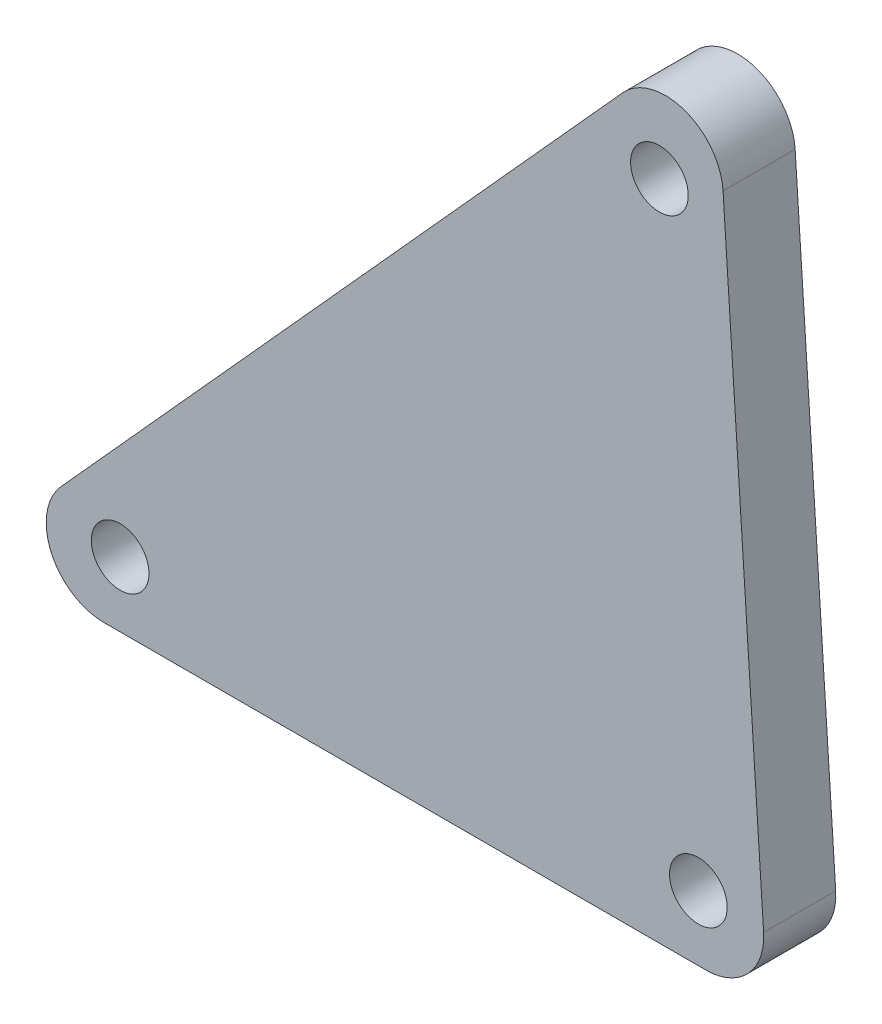
ISO-10303-21;
HEADER;
FILE_DESCRIPTION(('STEP AP214'),'2;1');
FILE_NAME('part.step','',(''),(''),'','','');
FILE_SCHEMA(('AUTOMOTIVE_DESIGN { 1 0 10303 214 1 1 1 1 }'));
ENDSEC;
DATA;
#1=APPLICATION_CONTEXT('core data for automotive mechanical design processes');
#2=APPLICATION_PROTOCOL_DEFINITION('international standard','automotive_design',2000,#1);
#3=PRODUCT_CONTEXT('',#1,'mechanical');
#4=PRODUCT('Part','Part','',(#3));
#5=PRODUCT_RELATED_PRODUCT_CATEGORY('part','',(#4));
#6=PRODUCT_DEFINITION_FORMATION('','',#4);
#7=PRODUCT_DEFINITION_CONTEXT('part definition',#1,'design');
#8=PRODUCT_DEFINITION('design','',#6,#7);
#9=PRODUCT_DEFINITION_SHAPE('','',#8);
#10=(LENGTH_UNIT() NAMED_UNIT(*) SI_UNIT(.MILLI.,.METRE.));
#11=(NAMED_UNIT(*) PLANE_ANGLE_UNIT() SI_UNIT($,.RADIAN.));
#12=(NAMED_UNIT(*) SI_UNIT($,.STERADIAN.) SOLID_ANGLE_UNIT());
#13=UNCERTAINTY_MEASURE_WITH_UNIT(LENGTH_MEASURE(1.E-05),#10,'distance_accuracy_value','');
#14=(GEOMETRIC_REPRESENTATION_CONTEXT(3) GLOBAL_UNCERTAINTY_ASSIGNED_CONTEXT((#13)) GLOBAL_UNIT_ASSIGNED_CONTEXT((#10,
#11,#12)) REPRESENTATION_CONTEXT('',''));
#15=CARTESIAN_POINT('',(0.,0.,0.));
#16=DIRECTION('',(0.,0.,1.));
#17=DIRECTION('',(1.,0.,0.));
#18=AXIS2_PLACEMENT_3D('',#15,#16,#17);
#19=CARTESIAN_POINT('',(3.23467115534947,-41.9120104857433,2.5));
#20=DIRECTION('',(0.,0.,1.));
#21=DIRECTION('',(1.,0.,0.));
#22=AXIS2_PLACEMENT_3D('',#19,#20,#21);
#23=PLANE('',#22);
#24=CARTESIAN_POINT('',(2.70099750623443,-41.4120104857433,2.5));
#25=DIRECTION('',(0.,0.,1.));
#26=DIRECTION('',(1.,0.,0.));
#27=AXIS2_PLACEMENT_3D('',#24,#25,#26);
#28=CIRCLE('',#27,2.);
#29=CARTESIAN_POINT('',(4.70099750623443,-41.4120104857433,2.5));
#30=VERTEX_POINT('',#29);
#31=EDGE_CURVE('E184',#30,#30,#28,.T.);
#32=ORIENTED_EDGE('',*,*,#31,.F.);
#33=EDGE_LOOP('',(#32));
#34=FACE_BOUND('',#33,.T.);
#35=CARTESIAN_POINT('',(3.23467115534947,-41.9120104857433,2.5));
#36=DIRECTION('',(0.,0.,1.));
#37=DIRECTION('',(1.,0.,0.));
#38=AXIS2_PLACEMENT_3D('',#35,#36,#37);
#39=CIRCLE('',#38,4.);
#40=CARTESIAN_POINT('',(3.23467115534944,-45.9120104857433,2.5));
#41=VERTEX_POINT('',#40);
#42=CARTESIAN_POINT('',(7.22619023831268,-41.6516733767087,2.5));
#43=VERTEX_POINT('',#42);
#44=EDGE_CURVE('E129',#41,#43,#39,.T.);
#45=ORIENTED_EDGE('',*,*,#44,.T.);
#46=DIRECTION('',(-0.0650842772586609,0.997879770740803,0.));
#47=VECTOR('',#46,1.);
#48=CARTESIAN_POINT('',(7.22619023831268,-41.6516733767087,2.5));
#49=LINE('',#48,#47);
#50=CARTESIAN_POINT('',(4.41345232933386,1.47355406664054,2.5));
#51=VERTEX_POINT('',#50);
#52=EDGE_CURVE('E87',#43,#51,#49,.T.);
#53=ORIENTED_EDGE('',*,*,#52,.T.);
#54=CARTESIAN_POINT('',(0.421933246370646,1.21321695760599,2.5));
#55=DIRECTION('',(0.,0.,1.));
#56=DIRECTION('',(1.,0.,0.));
#57=AXIS2_PLACEMENT_3D('',#54,#55,#56);
#58=CIRCLE('',#57,4.);
#59=CARTESIAN_POINT('',(-2.54666965583324,3.89414903601205,2.5));
#60=VERTEX_POINT('',#59);
#61=EDGE_CURVE('E100',#51,#60,#58,.T.);
#62=ORIENTED_EDGE('',*,*,#61,.T.);
#63=DIRECTION('',(-0.670233019601534,-0.742150725550956,0.));
#64=VECTOR('',#63,1.);
#65=CARTESIAN_POINT('',(-2.54666965583324,3.89414903601205,2.5));
#66=LINE('',#65,#64);
#67=CARTESIAN_POINT('',(-41.492870764646,-39.2310784073371,2.5));
#68=VERTEX_POINT('',#67);
#69=EDGE_CURVE('E94',#60,#68,#66,.T.);
#70=ORIENTED_EDGE('',*,*,#69,.T.);
#71=CARTESIAN_POINT('',(-38.5242678624422,-41.9120104857433,2.5));
#72=DIRECTION('',(0.,0.,1.));
#73=DIRECTION('',(-1.,0.,0.));
#74=AXIS2_PLACEMENT_3D('',#71,#72,#73);
#75=CIRCLE('',#74,4.);
#76=CARTESIAN_POINT('',(-38.5242678624422,-45.9120104857433,2.5));
#77=VERTEX_POINT('',#76);
#78=EDGE_CURVE('E98',#68,#77,#75,.T.);
#79=ORIENTED_EDGE('',*,*,#78,.T.);
#80=DIRECTION('',(1.,0.,0.));
#81=VECTOR('',#80,1.);
#82=CARTESIAN_POINT('',(-38.5242678624422,-45.9120104857433,2.5));
#83=LINE('',#82,#81);
#84=EDGE_CURVE('E50',#77,#41,#83,.T.);
#85=ORIENTED_EDGE('',*,*,#84,.T.);
#86=EDGE_LOOP('',(#45,#53,#62,#70,#79,#85));
#87=FACE_BOUND('',#86,.T.);
#88=CARTESIAN_POINT('',(0.,0.,2.5));
#89=DIRECTION('',(0.,0.,1.));
#90=DIRECTION('',(1.,0.,0.));
#91=AXIS2_PLACEMENT_3D('',#88,#89,#90);
#92=CIRCLE('',#91,2.);
#93=CARTESIAN_POINT('',(2.,0.,2.5));
#94=VERTEX_POINT('',#93);
#95=EDGE_CURVE('E122',#94,#94,#92,.T.);
#96=ORIENTED_EDGE('',*,*,#95,.F.);
#97=EDGE_LOOP('',(#96));
#98=FACE_BOUND('',#97,.T.);
#99=CARTESIAN_POINT('',(-37.3990024937656,-41.4120104857433,2.5));
#100=DIRECTION('',(0.,0.,1.));
#101=DIRECTION('',(1.,0.,0.));
#102=AXIS2_PLACEMENT_3D('',#99,#100,#101);
#103=CIRCLE('',#102,2.);
#104=CARTESIAN_POINT('',(-35.3990024937656,-41.4120104857433,2.5));
#105=VERTEX_POINT('',#104);
#106=EDGE_CURVE('E175',#105,#105,#103,.T.);
#107=ORIENTED_EDGE('',*,*,#106,.F.);
#108=EDGE_LOOP('',(#107));
#109=FACE_BOUND('',#108,.T.);
#110=ADVANCED_FACE('F33',(#34,#87,#98,#109),#23,.T.);
#111=CARTESIAN_POINT('',(3.23467115534947,-41.9120104857433,-2.5));
#112=DIRECTION('',(0.,0.,1.));
#113=DIRECTION('',(1.,0.,0.));
#114=AXIS2_PLACEMENT_3D('',#111,#112,#113);
#115=PLANE('',#114);
#116=CARTESIAN_POINT('',(3.23467115534947,-41.9120104857433,-2.5));
#117=DIRECTION('',(0.,0.,1.));
#118=DIRECTION('',(1.,0.,0.));
#119=AXIS2_PLACEMENT_3D('',#116,#117,#118);
#120=CIRCLE('',#119,4.);
#121=CARTESIAN_POINT('',(3.23467115534944,-45.9120104857433,-2.5));
#122=VERTEX_POINT('',#121);
#123=CARTESIAN_POINT('',(7.22619023831268,-41.6516733767087,-2.5));
#124=VERTEX_POINT('',#123);
#125=EDGE_CURVE('E118',#122,#124,#120,.T.);
#126=ORIENTED_EDGE('',*,*,#125,.F.);
#127=DIRECTION('',(1.,0.,0.));
#128=VECTOR('',#127,1.);
#129=CARTESIAN_POINT('',(-38.5242678624422,-45.9120104857433,-2.5));
#130=LINE('',#129,#128);
#131=CARTESIAN_POINT('',(-38.5242678624422,-45.9120104857433,-2.5));
#132=VERTEX_POINT('',#131);
#133=EDGE_CURVE('E79',#132,#122,#130,.T.);
#134=ORIENTED_EDGE('',*,*,#133,.F.);
#135=CARTESIAN_POINT('',(-38.5242678624422,-41.9120104857433,-2.5));
#136=DIRECTION('',(0.,0.,1.));
#137=DIRECTION('',(-1.,0.,0.));
#138=AXIS2_PLACEMENT_3D('',#135,#136,#137);
#139=CIRCLE('',#138,4.);
#140=CARTESIAN_POINT('',(-41.492870764646,-39.2310784073371,-2.5));
#141=VERTEX_POINT('',#140);
#142=EDGE_CURVE('E73',#141,#132,#139,.T.);
#143=ORIENTED_EDGE('',*,*,#142,.F.);
#144=DIRECTION('',(-0.670233019601534,-0.742150725550956,0.));
#145=VECTOR('',#144,1.);
#146=CARTESIAN_POINT('',(-2.54666965583324,3.89414903601205,-2.5));
#147=LINE('',#146,#145);
#148=CARTESIAN_POINT('',(-2.54666965583324,3.89414903601205,-2.5));
#149=VERTEX_POINT('',#148);
#150=EDGE_CURVE('E108',#149,#141,#147,.T.);
#151=ORIENTED_EDGE('',*,*,#150,.F.);
#152=CARTESIAN_POINT('',(0.421933246370646,1.21321695760599,-2.5));
#153=DIRECTION('',(0.,0.,1.));
#154=DIRECTION('',(1.,0.,0.));
#155=AXIS2_PLACEMENT_3D('',#152,#153,#154);
#156=CIRCLE('',#155,4.);
#157=CARTESIAN_POINT('',(4.41345232933386,1.47355406664054,-2.5));
#158=VERTEX_POINT('',#157);
#159=EDGE_CURVE('E124',#158,#149,#156,.T.);
#160=ORIENTED_EDGE('',*,*,#159,.F.);
#161=DIRECTION('',(-0.0650842772586609,0.997879770740803,0.));
#162=VECTOR('',#161,1.);
#163=CARTESIAN_POINT('',(7.22619023831268,-41.6516733767087,-2.5));
#164=LINE('',#163,#162);
#165=EDGE_CURVE('E121',#124,#158,#164,.T.);
#166=ORIENTED_EDGE('',*,*,#165,.F.);
#167=EDGE_LOOP('',(#126,#134,#143,#151,#160,#166));
#168=FACE_BOUND('',#167,.T.);
#169=CARTESIAN_POINT('',(0.,0.,-2.5));
#170=DIRECTION('',(0.,0.,1.));
#171=DIRECTION('',(1.,0.,0.));
#172=AXIS2_PLACEMENT_3D('',#169,#170,#171);
#173=CIRCLE('',#172,2.);
#174=CARTESIAN_POINT('',(2.,0.,-2.5));
#175=VERTEX_POINT('',#174);
#176=EDGE_CURVE('E187',#175,#175,#173,.T.);
#177=ORIENTED_EDGE('',*,*,#176,.T.);
#178=EDGE_LOOP('',(#177));
#179=FACE_BOUND('',#178,.T.);
#180=CARTESIAN_POINT('',(2.70099750623443,-41.4120104857433,-2.5));
#181=DIRECTION('',(0.,0.,1.));
#182=DIRECTION('',(1.,0.,0.));
#183=AXIS2_PLACEMENT_3D('',#180,#181,#182);
#184=CIRCLE('',#183,2.);
#185=CARTESIAN_POINT('',(4.70099750623443,-41.4120104857433,-2.5));
#186=VERTEX_POINT('',#185);
#187=EDGE_CURVE('E181',#186,#186,#184,.T.);
#188=ORIENTED_EDGE('',*,*,#187,.T.);
#189=EDGE_LOOP('',(#188));
#190=FACE_BOUND('',#189,.T.);
#191=CARTESIAN_POINT('',(-37.3990024937656,-41.4120104857433,-2.5));
#192=DIRECTION('',(0.,0.,1.));
#193=DIRECTION('',(1.,0.,0.));
#194=AXIS2_PLACEMENT_3D('',#191,#192,#193);
#195=CIRCLE('',#194,2.);
#196=CARTESIAN_POINT('',(-35.3990024937656,-41.4120104857433,-2.5));
#197=VERTEX_POINT('',#196);
#198=EDGE_CURVE('E178',#197,#197,#195,.T.);
#199=ORIENTED_EDGE('',*,*,#198,.T.);
#200=EDGE_LOOP('',(#199));
#201=FACE_BOUND('',#200,.T.);
#202=ADVANCED_FACE('F138',(#168,#179,#190,#201),#115,.F.);
#203=CARTESIAN_POINT('',(3.23467115534947,-41.9120104857433,2.5));
#204=DIRECTION('',(0.,0.,-1.));
#205=DIRECTION('',(-1.,0.,0.));
#206=AXIS2_PLACEMENT_3D('',#203,#204,#205);
#207=CYLINDRICAL_SURFACE('',#206,4.);
#208=ORIENTED_EDGE('',*,*,#125,.T.);
#209=DIRECTION('',(0.,0.,-1.));
#210=VECTOR('',#209,1.);
#211=CARTESIAN_POINT('',(7.22619023831268,-41.6516733767087,2.5));
#212=LINE('',#211,#210);
#213=EDGE_CURVE('E11',#43,#124,#212,.T.);
#214=ORIENTED_EDGE('',*,*,#213,.F.);
#215=ORIENTED_EDGE('',*,*,#44,.F.);
#216=DIRECTION('',(0.,0.,-1.));
#217=VECTOR('',#216,1.);
#218=CARTESIAN_POINT('',(3.23467115534944,-45.9120104857433,2.5));
#219=LINE('',#218,#217);
#220=EDGE_CURVE('E114',#41,#122,#219,.T.);
#221=ORIENTED_EDGE('',*,*,#220,.T.);
#222=EDGE_LOOP('',(#208,#214,#215,#221));
#223=FACE_BOUND('',#222,.T.);
#224=ADVANCED_FACE('F35',(#223),#207,.T.);
#225=CARTESIAN_POINT('',(7.22619023831268,-41.6516733767087,2.5));
#226=DIRECTION('',(-0.997879770740803,-0.0650842772586609,0.));
#227=DIRECTION('',(0.0650842772586609,-0.997879770740803,0.));
#228=AXIS2_PLACEMENT_3D('',#225,#226,#227);
#229=PLANE('',#228);
#230=ORIENTED_EDGE('',*,*,#165,.T.);
#231=DIRECTION('',(0.,0.,-1.));
#232=VECTOR('',#231,1.);
#233=CARTESIAN_POINT('',(4.41345232933386,1.47355406664054,2.5));
#234=LINE('',#233,#232);
#235=EDGE_CURVE('E42',#51,#158,#234,.T.);
#236=ORIENTED_EDGE('',*,*,#235,.F.);
#237=ORIENTED_EDGE('',*,*,#52,.F.);
#238=ORIENTED_EDGE('',*,*,#213,.T.);
#239=EDGE_LOOP('',(#230,#236,#237,#238));
#240=FACE_BOUND('',#239,.T.);
#241=ADVANCED_FACE('F237',(#240),#229,.F.);
#242=CARTESIAN_POINT('',(0.421933246370646,1.21321695760599,2.5));
#243=DIRECTION('',(0.,0.,-1.));
#244=DIRECTION('',(-1.,0.,0.));
#245=AXIS2_PLACEMENT_3D('',#242,#243,#244);
#246=CYLINDRICAL_SURFACE('',#245,4.);
#247=ORIENTED_EDGE('',*,*,#159,.T.);
#248=DIRECTION('',(0.,0.,-1.));
#249=VECTOR('',#248,1.);
#250=CARTESIAN_POINT('',(-2.54666965583324,3.89414903601205,2.5));
#251=LINE('',#250,#249);
#252=EDGE_CURVE('E109',#60,#149,#251,.T.);
#253=ORIENTED_EDGE('',*,*,#252,.F.);
#254=ORIENTED_EDGE('',*,*,#61,.F.);
#255=ORIENTED_EDGE('',*,*,#235,.T.);
#256=EDGE_LOOP('',(#247,#253,#254,#255));
#257=FACE_BOUND('',#256,.T.);
#258=ADVANCED_FACE('F135',(#257),#246,.T.);
#259=CARTESIAN_POINT('',(-2.54666965583324,3.89414903601205,2.5));
#260=DIRECTION('',(0.742150725550956,-0.670233019601534,0.));
#261=DIRECTION('',(0.670233019601534,0.742150725550956,0.));
#262=AXIS2_PLACEMENT_3D('',#259,#260,#261);
#263=PLANE('',#262);
#264=ORIENTED_EDGE('',*,*,#150,.T.);
#265=DIRECTION('',(0.,0.,-1.));
#266=VECTOR('',#265,1.);
#267=CARTESIAN_POINT('',(-41.492870764646,-39.2310784073371,2.5));
#268=LINE('',#267,#266);
#269=EDGE_CURVE('E105',#68,#141,#268,.T.);
#270=ORIENTED_EDGE('',*,*,#269,.F.);
#271=ORIENTED_EDGE('',*,*,#69,.F.);
#272=ORIENTED_EDGE('',*,*,#252,.T.);
#273=EDGE_LOOP('',(#264,#270,#271,#272));
#274=FACE_BOUND('',#273,.T.);
#275=ADVANCED_FACE('F106',(#274),#263,.F.);
#276=CARTESIAN_POINT('',(-38.5242678624422,-41.9120104857433,2.5));
#277=DIRECTION('',(0.,0.,-1.));
#278=DIRECTION('',(-1.,0.,0.));
#279=AXIS2_PLACEMENT_3D('',#276,#277,#278);
#280=CYLINDRICAL_SURFACE('',#279,4.);
#281=ORIENTED_EDGE('',*,*,#142,.T.);
#282=DIRECTION('',(0.,0.,-1.));
#283=VECTOR('',#282,1.);
#284=CARTESIAN_POINT('',(-38.5242678624422,-45.9120104857433,2.5));
#285=LINE('',#284,#283);
#286=EDGE_CURVE('E110',#77,#132,#285,.T.);
#287=ORIENTED_EDGE('',*,*,#286,.F.);
#288=ORIENTED_EDGE('',*,*,#78,.F.);
#289=ORIENTED_EDGE('',*,*,#269,.T.);
#290=EDGE_LOOP('',(#281,#287,#288,#289));
#291=FACE_BOUND('',#290,.T.);
#292=ADVANCED_FACE('F112',(#291),#280,.T.);
#293=CARTESIAN_POINT('',(-38.5242678624422,-45.9120104857433,2.5));
#294=DIRECTION('',(0.,1.,0.));
#295=DIRECTION('',(0.,0.,1.));
#296=AXIS2_PLACEMENT_3D('',#293,#294,#295);
#297=PLANE('',#296);
#298=ORIENTED_EDGE('',*,*,#133,.T.);
#299=ORIENTED_EDGE('',*,*,#220,.F.);
#300=ORIENTED_EDGE('',*,*,#84,.F.);
#301=ORIENTED_EDGE('',*,*,#286,.T.);
#302=EDGE_LOOP('',(#298,#299,#300,#301));
#303=FACE_BOUND('',#302,.T.);
#304=ADVANCED_FACE('F143',(#303),#297,.F.);
#305=CARTESIAN_POINT('',(0.,0.,2.5));
#306=DIRECTION('',(0.,0.,-1.));
#307=DIRECTION('',(-1.,0.,0.));
#308=AXIS2_PLACEMENT_3D('',#305,#306,#307);
#309=CYLINDRICAL_SURFACE('',#308,2.);
#310=ORIENTED_EDGE('',*,*,#95,.T.);
#311=EDGE_LOOP('',(#310));
#312=FACE_BOUND('',#311,.T.);
#313=ORIENTED_EDGE('',*,*,#176,.F.);
#314=EDGE_LOOP('',(#313));
#315=FACE_BOUND('',#314,.T.);
#316=ADVANCED_FACE('F145',(#312,#315),#309,.F.);
#317=CARTESIAN_POINT('',(2.70099750623443,-41.4120104857433,2.5));
#318=DIRECTION('',(0.,0.,-1.));
#319=DIRECTION('',(-1.,0.,0.));
#320=AXIS2_PLACEMENT_3D('',#317,#318,#319);
#321=CYLINDRICAL_SURFACE('',#320,2.);
#322=ORIENTED_EDGE('',*,*,#31,.T.);
#323=EDGE_LOOP('',(#322));
#324=FACE_BOUND('',#323,.T.);
#325=ORIENTED_EDGE('',*,*,#187,.F.);
#326=EDGE_LOOP('',(#325));
#327=FACE_BOUND('',#326,.T.);
#328=ADVANCED_FACE('F151',(#324,#327),#321,.F.);
#329=CARTESIAN_POINT('',(-37.3990024937656,-41.4120104857433,2.5));
#330=DIRECTION('',(0.,0.,-1.));
#331=DIRECTION('',(-1.,0.,0.));
#332=AXIS2_PLACEMENT_3D('',#329,#330,#331);
#333=CYLINDRICAL_SURFACE('',#332,2.);
#334=ORIENTED_EDGE('',*,*,#106,.T.);
#335=EDGE_LOOP('',(#334));
#336=FACE_BOUND('',#335,.T.);
#337=ORIENTED_EDGE('',*,*,#198,.F.);
#338=EDGE_LOOP('',(#337));
#339=FACE_BOUND('',#338,.T.);
#340=ADVANCED_FACE('F166',(#336,#339),#333,.F.);
#341=CLOSED_SHELL('',(#110,#202,#224,#241,#258,#275,#292,#304,#316,#328,#340));
#342=MANIFOLD_SOLID_BREP('B2',#341);
#343=ADVANCED_BREP_SHAPE_REPRESENTATION('',(#18,#342),#14);
#344=SHAPE_DEFINITION_REPRESENTATION(#9,#343);
ENDSEC;
END-ISO-10303-21;
